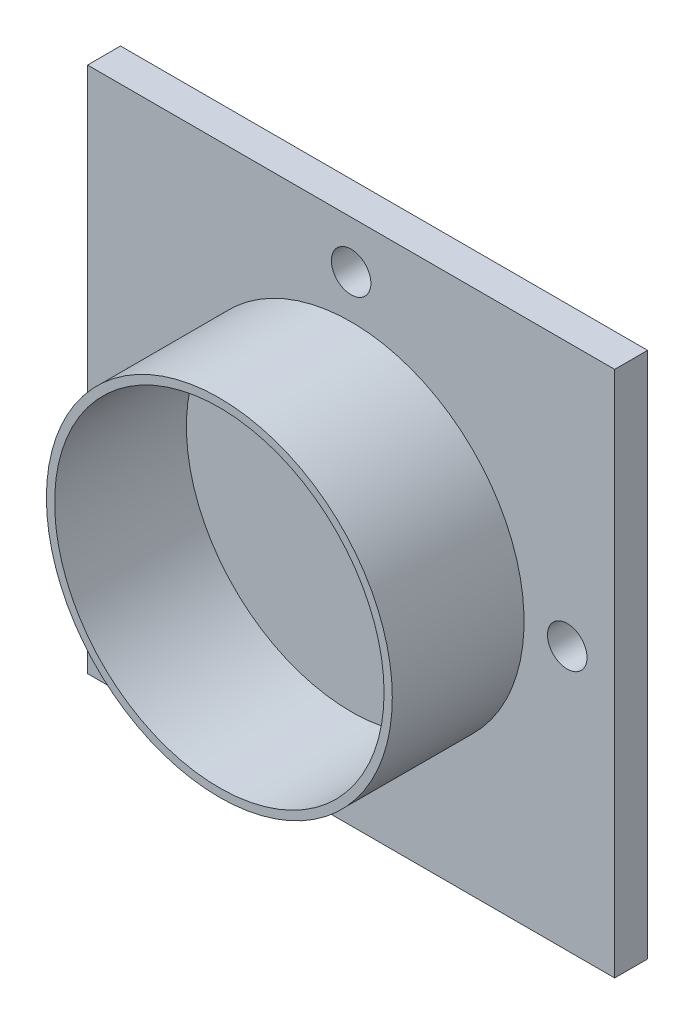
ISO-10303-21;
HEADER;
FILE_DESCRIPTION(('STEP AP214'),'2;1');
FILE_NAME('part.step','',(''),(''),'','','');
FILE_SCHEMA(('AUTOMOTIVE_DESIGN { 1 0 10303 214 1 1 1 1 }'));
ENDSEC;
DATA;
#1=APPLICATION_CONTEXT('core data for automotive mechanical design processes');
#2=APPLICATION_PROTOCOL_DEFINITION('international standard','automotive_design',2000,#1);
#3=PRODUCT_CONTEXT('',#1,'mechanical');
#4=PRODUCT('Part','Part','',(#3));
#5=PRODUCT_RELATED_PRODUCT_CATEGORY('part','',(#4));
#6=PRODUCT_DEFINITION_FORMATION('','',#4);
#7=PRODUCT_DEFINITION_CONTEXT('part definition',#1,'design');
#8=PRODUCT_DEFINITION('design','',#6,#7);
#9=PRODUCT_DEFINITION_SHAPE('','',#8);
#10=(LENGTH_UNIT() NAMED_UNIT(*) SI_UNIT(.MILLI.,.METRE.));
#11=(NAMED_UNIT(*) PLANE_ANGLE_UNIT() SI_UNIT($,.RADIAN.));
#12=(NAMED_UNIT(*) SI_UNIT($,.STERADIAN.) SOLID_ANGLE_UNIT());
#13=UNCERTAINTY_MEASURE_WITH_UNIT(LENGTH_MEASURE(1.E-05),#10,'distance_accuracy_value','');
#14=(GEOMETRIC_REPRESENTATION_CONTEXT(3) GLOBAL_UNCERTAINTY_ASSIGNED_CONTEXT((#13)) GLOBAL_UNIT_ASSIGNED_CONTEXT((#10,
#11,#12)) REPRESENTATION_CONTEXT('',''));
#15=CARTESIAN_POINT('',(0.,0.,0.));
#16=DIRECTION('',(0.,0.,1.));
#17=DIRECTION('',(1.,0.,0.));
#18=AXIS2_PLACEMENT_3D('',#15,#16,#17);
#19=CARTESIAN_POINT('',(-39.9047680999544,-160.,20.));
#20=DIRECTION('',(1.,0.,0.));
#21=DIRECTION('',(0.,0.,-1.));
#22=AXIS2_PLACEMENT_3D('',#19,#20,#21);
#23=PLANE('',#22);
#24=DIRECTION('',(0.,-1.,0.));
#25=VECTOR('',#24,1.);
#26=CARTESIAN_POINT('',(-39.9047680999544,-160.,0.));
#27=LINE('',#26,#25);
#28=CARTESIAN_POINT('',(-39.9047680999544,160.,0.));
#29=VERTEX_POINT('',#28);
#30=CARTESIAN_POINT('',(-39.9047680999544,-160.,0.));
#31=VERTEX_POINT('',#30);
#32=EDGE_CURVE('E107',#29,#31,#27,.T.);
#33=ORIENTED_EDGE('',*,*,#32,.T.);
#34=DIRECTION('',(0.,0.,-1.));
#35=VECTOR('',#34,1.);
#36=CARTESIAN_POINT('',(-39.9047680999544,-160.,20.));
#37=LINE('',#36,#35);
#38=CARTESIAN_POINT('',(-39.9047680999544,-160.,20.));
#39=VERTEX_POINT('',#38);
#40=EDGE_CURVE('E49',#39,#31,#37,.T.);
#41=ORIENTED_EDGE('',*,*,#40,.F.);
#42=DIRECTION('',(0.,-1.,0.));
#43=VECTOR('',#42,1.);
#44=CARTESIAN_POINT('',(-39.9047680999544,-160.,20.));
#45=LINE('',#44,#43);
#46=CARTESIAN_POINT('',(-39.9047680999544,160.,20.));
#47=VERTEX_POINT('',#46);
#48=EDGE_CURVE('E93',#47,#39,#45,.T.);
#49=ORIENTED_EDGE('',*,*,#48,.F.);
#50=DIRECTION('',(0.,0.,-1.));
#51=VECTOR('',#50,1.);
#52=CARTESIAN_POINT('',(-39.9047680999544,160.,20.));
#53=LINE('',#52,#51);
#54=EDGE_CURVE('E103',#47,#29,#53,.T.);
#55=ORIENTED_EDGE('',*,*,#54,.T.);
#56=EDGE_LOOP('',(#33,#41,#49,#55));
#57=FACE_BOUND('',#56,.T.);
#58=ADVANCED_FACE('F41',(#57),#23,.F.);
#59=CARTESIAN_POINT('',(-39.9047680999544,-160.,20.));
#60=DIRECTION('',(0.,1.,0.));
#61=DIRECTION('',(-1.,0.,0.));
#62=AXIS2_PLACEMENT_3D('',#59,#60,#61);
#63=PLANE('',#62);
#64=DIRECTION('',(1.,0.,0.));
#65=VECTOR('',#64,1.);
#66=CARTESIAN_POINT('',(-39.9047680999544,-160.,0.));
#67=LINE('',#66,#65);
#68=CARTESIAN_POINT('',(280.095231900046,-160.,0.));
#69=VERTEX_POINT('',#68);
#70=EDGE_CURVE('E98',#31,#69,#67,.T.);
#71=ORIENTED_EDGE('',*,*,#70,.T.);
#72=DIRECTION('',(0.,0.,-1.));
#73=VECTOR('',#72,1.);
#74=CARTESIAN_POINT('',(280.095231900046,-160.,20.));
#75=LINE('',#74,#73);
#76=CARTESIAN_POINT('',(280.095231900046,-160.,20.));
#77=VERTEX_POINT('',#76);
#78=EDGE_CURVE('E96',#77,#69,#75,.T.);
#79=ORIENTED_EDGE('',*,*,#78,.F.);
#80=DIRECTION('',(1.,0.,0.));
#81=VECTOR('',#80,1.);
#82=CARTESIAN_POINT('',(-39.9047680999544,-160.,20.));
#83=LINE('',#82,#81);
#84=EDGE_CURVE('E88',#39,#77,#83,.T.);
#85=ORIENTED_EDGE('',*,*,#84,.F.);
#86=ORIENTED_EDGE('',*,*,#40,.T.);
#87=EDGE_LOOP('',(#71,#79,#85,#86));
#88=FACE_BOUND('',#87,.T.);
#89=ADVANCED_FACE('F97',(#88),#63,.F.);
#90=CARTESIAN_POINT('',(280.095231900046,-160.,20.));
#91=DIRECTION('',(-1.,0.,0.));
#92=DIRECTION('',(0.,0.,1.));
#93=AXIS2_PLACEMENT_3D('',#90,#91,#92);
#94=PLANE('',#93);
#95=DIRECTION('',(0.,1.,0.));
#96=VECTOR('',#95,1.);
#97=CARTESIAN_POINT('',(280.095231900046,-160.,0.));
#98=LINE('',#97,#96);
#99=CARTESIAN_POINT('',(280.095231900046,160.,0.));
#100=VERTEX_POINT('',#99);
#101=EDGE_CURVE('E74',#69,#100,#98,.T.);
#102=ORIENTED_EDGE('',*,*,#101,.T.);
#103=DIRECTION('',(0.,0.,-1.));
#104=VECTOR('',#103,1.);
#105=CARTESIAN_POINT('',(280.095231900046,160.,20.));
#106=LINE('',#105,#104);
#107=CARTESIAN_POINT('',(280.095231900046,160.,20.));
#108=VERTEX_POINT('',#107);
#109=EDGE_CURVE('E99',#108,#100,#106,.T.);
#110=ORIENTED_EDGE('',*,*,#109,.F.);
#111=DIRECTION('',(0.,1.,0.));
#112=VECTOR('',#111,1.);
#113=CARTESIAN_POINT('',(280.095231900046,-160.,20.));
#114=LINE('',#113,#112);
#115=EDGE_CURVE('E91',#77,#108,#114,.T.);
#116=ORIENTED_EDGE('',*,*,#115,.F.);
#117=ORIENTED_EDGE('',*,*,#78,.T.);
#118=EDGE_LOOP('',(#102,#110,#116,#117));
#119=FACE_BOUND('',#118,.T.);
#120=ADVANCED_FACE('F101',(#119),#94,.F.);
#121=CARTESIAN_POINT('',(-39.9047680999544,160.,20.));
#122=DIRECTION('',(0.,-1.,0.));
#123=DIRECTION('',(1.,0.,0.));
#124=AXIS2_PLACEMENT_3D('',#121,#122,#123);
#125=PLANE('',#124);
#126=DIRECTION('',(-1.,0.,0.));
#127=VECTOR('',#126,1.);
#128=CARTESIAN_POINT('',(-39.9047680999544,160.,0.));
#129=LINE('',#128,#127);
#130=EDGE_CURVE('E80',#100,#29,#129,.T.);
#131=ORIENTED_EDGE('',*,*,#130,.T.);
#132=ORIENTED_EDGE('',*,*,#54,.F.);
#133=DIRECTION('',(-1.,0.,0.));
#134=VECTOR('',#133,1.);
#135=CARTESIAN_POINT('',(-39.9047680999544,160.,20.));
#136=LINE('',#135,#134);
#137=EDGE_CURVE('E57',#108,#47,#136,.T.);
#138=ORIENTED_EDGE('',*,*,#137,.F.);
#139=ORIENTED_EDGE('',*,*,#109,.T.);
#140=EDGE_LOOP('',(#131,#132,#138,#139));
#141=FACE_BOUND('',#140,.T.);
#142=ADVANCED_FACE('F131',(#141),#125,.F.);
#143=CARTESIAN_POINT('',(0.,0.,20.));
#144=DIRECTION('',(0.,0.,-1.));
#145=DIRECTION('',(-1.,0.,0.));
#146=AXIS2_PLACEMENT_3D('',#143,#144,#145);
#147=PLANE('',#146);
#148=CARTESIAN_POINT('',(120.095231900046,131.208738881373,20.));
#149=DIRECTION('',(0.,0.,1.));
#150=DIRECTION('',(1.,0.,0.));
#151=AXIS2_PLACEMENT_3D('',#148,#149,#150);
#152=CIRCLE('',#151,12.);
#153=CARTESIAN_POINT('',(132.095231900046,131.208738881373,20.));
#154=VERTEX_POINT('',#153);
#155=EDGE_CURVE('E254',#154,#154,#152,.T.);
#156=ORIENTED_EDGE('',*,*,#155,.F.);
#157=EDGE_LOOP('',(#156));
#158=FACE_BOUND('',#157,.T.);
#159=CARTESIAN_POINT('',(251.303970781419,-4.30211422042248E-13,20.));
#160=DIRECTION('',(0.,0.,1.));
#161=DIRECTION('',(1.,0.,0.));
#162=AXIS2_PLACEMENT_3D('',#159,#160,#161);
#163=CIRCLE('',#162,12.);
#164=CARTESIAN_POINT('',(263.303970781419,-4.30211422042248E-13,20.));
#165=VERTEX_POINT('',#164);
#166=EDGE_CURVE('E255',#165,#165,#163,.T.);
#167=ORIENTED_EDGE('',*,*,#166,.F.);
#168=EDGE_LOOP('',(#167));
#169=FACE_BOUND('',#168,.T.);
#170=CARTESIAN_POINT('',(120.095231900045,-131.208738881373,20.));
#171=DIRECTION('',(0.,0.,1.));
#172=DIRECTION('',(1.,0.,0.));
#173=AXIS2_PLACEMENT_3D('',#170,#171,#172);
#174=CIRCLE('',#173,12.);
#175=CARTESIAN_POINT('',(132.095231900045,-131.208738881373,20.));
#176=VERTEX_POINT('',#175);
#177=EDGE_CURVE('E265',#176,#176,#174,.T.);
#178=ORIENTED_EDGE('',*,*,#177,.F.);
#179=EDGE_LOOP('',(#178));
#180=FACE_BOUND('',#179,.T.);
#181=CARTESIAN_POINT('',(-11.1135069813274,1.37390099297363E-12,20.));
#182=DIRECTION('',(0.,0.,1.));
#183=DIRECTION('',(1.,0.,0.));
#184=AXIS2_PLACEMENT_3D('',#181,#182,#183);
#185=CIRCLE('',#184,12.);
#186=CARTESIAN_POINT('',(0.886493018672574,1.37390099297363E-12,20.));
#187=VERTEX_POINT('',#186);
#188=EDGE_CURVE('E271',#187,#187,#185,.T.);
#189=ORIENTED_EDGE('',*,*,#188,.F.);
#190=EDGE_LOOP('',(#189));
#191=FACE_BOUND('',#190,.T.);
#192=CARTESIAN_POINT('',(120.095231900046,0.,20.));
#193=DIRECTION('',(0.,0.,-1.));
#194=DIRECTION('',(-1.,0.,0.));
#195=AXIS2_PLACEMENT_3D('',#192,#193,#194);
#196=CIRCLE('',#195,105.);
#197=CARTESIAN_POINT('',(15.0952319000456,0.,20.));
#198=VERTEX_POINT('',#197);
#199=EDGE_CURVE('E11',#198,#198,#196,.F.);
#200=ORIENTED_EDGE('',*,*,#199,.F.);
#201=EDGE_LOOP('',(#200));
#202=FACE_BOUND('',#201,.T.);
#203=ORIENTED_EDGE('',*,*,#48,.T.);
#204=ORIENTED_EDGE('',*,*,#84,.T.);
#205=ORIENTED_EDGE('',*,*,#115,.T.);
#206=ORIENTED_EDGE('',*,*,#137,.T.);
#207=EDGE_LOOP('',(#203,#204,#205,#206));
#208=FACE_BOUND('',#207,.T.);
#209=ADVANCED_FACE('F89',(#158,#169,#180,#191,#202,#208),#147,.F.);
#210=CARTESIAN_POINT('',(0.,0.,0.));
#211=DIRECTION('',(0.,0.,-1.));
#212=DIRECTION('',(-1.,0.,0.));
#213=AXIS2_PLACEMENT_3D('',#210,#211,#212);
#214=PLANE('',#213);
#215=CARTESIAN_POINT('',(120.095231900046,131.208738881373,0.));
#216=DIRECTION('',(0.,0.,1.));
#217=DIRECTION('',(1.,0.,0.));
#218=AXIS2_PLACEMENT_3D('',#215,#216,#217);
#219=CIRCLE('',#218,12.);
#220=CARTESIAN_POINT('',(132.095231900046,131.208738881373,0.));
#221=VERTEX_POINT('',#220);
#222=EDGE_CURVE('E251',#221,#221,#219,.T.);
#223=ORIENTED_EDGE('',*,*,#222,.T.);
#224=EDGE_LOOP('',(#223));
#225=FACE_BOUND('',#224,.T.);
#226=CARTESIAN_POINT('',(251.303970781419,-4.30211422042248E-13,0.));
#227=DIRECTION('',(0.,0.,1.));
#228=DIRECTION('',(1.,0.,0.));
#229=AXIS2_PLACEMENT_3D('',#226,#227,#228);
#230=CIRCLE('',#229,12.);
#231=CARTESIAN_POINT('',(263.303970781419,-4.30211422042248E-13,0.));
#232=VERTEX_POINT('',#231);
#233=EDGE_CURVE('E260',#232,#232,#230,.T.);
#234=ORIENTED_EDGE('',*,*,#233,.T.);
#235=EDGE_LOOP('',(#234));
#236=FACE_BOUND('',#235,.T.);
#237=CARTESIAN_POINT('',(120.095231900045,-131.208738881373,0.));
#238=DIRECTION('',(0.,0.,1.));
#239=DIRECTION('',(1.,0.,0.));
#240=AXIS2_PLACEMENT_3D('',#237,#238,#239);
#241=CIRCLE('',#240,12.);
#242=CARTESIAN_POINT('',(132.095231900045,-131.208738881373,0.));
#243=VERTEX_POINT('',#242);
#244=EDGE_CURVE('E268',#243,#243,#241,.T.);
#245=ORIENTED_EDGE('',*,*,#244,.T.);
#246=EDGE_LOOP('',(#245));
#247=FACE_BOUND('',#246,.T.);
#248=CARTESIAN_POINT('',(-11.1135069813274,1.37390099297363E-12,0.));
#249=DIRECTION('',(0.,0.,1.));
#250=DIRECTION('',(1.,0.,0.));
#251=AXIS2_PLACEMENT_3D('',#248,#249,#250);
#252=CIRCLE('',#251,12.);
#253=CARTESIAN_POINT('',(0.886493018672574,1.37390099297363E-12,0.));
#254=VERTEX_POINT('',#253);
#255=EDGE_CURVE('E274',#254,#254,#252,.T.);
#256=ORIENTED_EDGE('',*,*,#255,.T.);
#257=EDGE_LOOP('',(#256));
#258=FACE_BOUND('',#257,.T.);
#259=ORIENTED_EDGE('',*,*,#32,.F.);
#260=ORIENTED_EDGE('',*,*,#130,.F.);
#261=ORIENTED_EDGE('',*,*,#101,.F.);
#262=ORIENTED_EDGE('',*,*,#70,.F.);
#263=EDGE_LOOP('',(#259,#260,#261,#262));
#264=FACE_BOUND('',#263,.T.);
#265=ADVANCED_FACE('F118',(#225,#236,#247,#258,#264),#214,.T.);
#266=CARTESIAN_POINT('',(120.095231900046,0.,100.));
#267=DIRECTION('',(0.,0.,1.));
#268=DIRECTION('',(1.,0.,0.));
#269=AXIS2_PLACEMENT_3D('',#266,#267,#268);
#270=PLANE('',#269);
#271=CARTESIAN_POINT('',(120.095231900046,0.,100.));
#272=DIRECTION('',(0.,0.,1.));
#273=DIRECTION('',(1.,0.,0.));
#274=AXIS2_PLACEMENT_3D('',#271,#272,#273);
#275=CIRCLE('',#274,105.);
#276=CARTESIAN_POINT('',(225.095231900046,0.,100.));
#277=VERTEX_POINT('',#276);
#278=EDGE_CURVE('E110',#277,#277,#275,.T.);
#279=ORIENTED_EDGE('',*,*,#278,.T.);
#280=EDGE_LOOP('',(#279));
#281=FACE_BOUND('',#280,.T.);
#282=CARTESIAN_POINT('',(120.095231900046,0.,100.));
#283=DIRECTION('',(0.,0.,1.));
#284=DIRECTION('',(1.,0.,0.));
#285=AXIS2_PLACEMENT_3D('',#282,#283,#284);
#286=CIRCLE('',#285,100.);
#287=CARTESIAN_POINT('',(220.095231900046,0.,100.));
#288=VERTEX_POINT('',#287);
#289=EDGE_CURVE('E277',#288,#288,#286,.T.);
#290=ORIENTED_EDGE('',*,*,#289,.F.);
#291=EDGE_LOOP('',(#290));
#292=FACE_BOUND('',#291,.T.);
#293=ADVANCED_FACE('F120',(#281,#292),#270,.T.);
#294=CARTESIAN_POINT('',(120.095231900046,0.,100.));
#295=DIRECTION('',(0.,0.,-1.));
#296=DIRECTION('',(-1.,0.,0.));
#297=AXIS2_PLACEMENT_3D('',#294,#295,#296);
#298=CYLINDRICAL_SURFACE('',#297,105.);
#299=ORIENTED_EDGE('',*,*,#278,.F.);
#300=EDGE_LOOP('',(#299));
#301=FACE_BOUND('',#300,.T.);
#302=ORIENTED_EDGE('',*,*,#199,.T.);
#303=EDGE_LOOP('',(#302));
#304=FACE_BOUND('',#303,.T.);
#305=ADVANCED_FACE('F128',(#301,#304),#298,.T.);
#306=CARTESIAN_POINT('',(120.095231900046,0.,100.));
#307=DIRECTION('',(0.,0.,-1.));
#308=DIRECTION('',(-1.,0.,0.));
#309=AXIS2_PLACEMENT_3D('',#306,#307,#308);
#310=CYLINDRICAL_SURFACE('',#309,100.);
#311=ORIENTED_EDGE('',*,*,#289,.T.);
#312=EDGE_LOOP('',(#311));
#313=FACE_BOUND('',#312,.T.);
#314=CARTESIAN_POINT('',(120.095231900046,0.,20.));
#315=DIRECTION('',(0.,0.,1.));
#316=DIRECTION('',(1.,0.,0.));
#317=AXIS2_PLACEMENT_3D('',#314,#315,#316);
#318=CIRCLE('',#317,100.);
#319=CARTESIAN_POINT('',(220.095231900046,0.,20.));
#320=VERTEX_POINT('',#319);
#321=EDGE_CURVE('E257',#320,#320,#318,.T.);
#322=ORIENTED_EDGE('',*,*,#321,.F.);
#323=EDGE_LOOP('',(#322));
#324=FACE_BOUND('',#323,.T.);
#325=ADVANCED_FACE('F165',(#313,#324),#310,.F.);
#326=ORIENTED_EDGE('',*,*,#321,.T.);
#327=EDGE_LOOP('',(#326));
#328=FACE_BOUND('',#327,.T.);
#329=ADVANCED_FACE('F134',(#328),#147,.F.);
#330=CARTESIAN_POINT('',(-11.1135069813274,1.37390099297363E-12,0.));
#331=DIRECTION('',(0.,0.,1.));
#332=DIRECTION('',(1.,0.,0.));
#333=AXIS2_PLACEMENT_3D('',#330,#331,#332);
#334=CYLINDRICAL_SURFACE('',#333,12.);
#335=ORIENTED_EDGE('',*,*,#255,.F.);
#336=EDGE_LOOP('',(#335));
#337=FACE_BOUND('',#336,.T.);
#338=ORIENTED_EDGE('',*,*,#188,.T.);
#339=EDGE_LOOP('',(#338));
#340=FACE_BOUND('',#339,.T.);
#341=ADVANCED_FACE('F182',(#337,#340),#334,.F.);
#342=CARTESIAN_POINT('',(120.095231900045,-131.208738881373,0.));
#343=DIRECTION('',(0.,0.,1.));
#344=DIRECTION('',(1.,0.,0.));
#345=AXIS2_PLACEMENT_3D('',#342,#343,#344);
#346=CYLINDRICAL_SURFACE('',#345,12.);
#347=ORIENTED_EDGE('',*,*,#244,.F.);
#348=EDGE_LOOP('',(#347));
#349=FACE_BOUND('',#348,.T.);
#350=ORIENTED_EDGE('',*,*,#177,.T.);
#351=EDGE_LOOP('',(#350));
#352=FACE_BOUND('',#351,.T.);
#353=ADVANCED_FACE('F215',(#349,#352),#346,.F.);
#354=CARTESIAN_POINT('',(251.303970781419,-4.30211422042248E-13,0.));
#355=DIRECTION('',(0.,0.,1.));
#356=DIRECTION('',(1.,0.,0.));
#357=AXIS2_PLACEMENT_3D('',#354,#355,#356);
#358=CYLINDRICAL_SURFACE('',#357,12.);
#359=ORIENTED_EDGE('',*,*,#233,.F.);
#360=EDGE_LOOP('',(#359));
#361=FACE_BOUND('',#360,.T.);
#362=ORIENTED_EDGE('',*,*,#166,.T.);
#363=EDGE_LOOP('',(#362));
#364=FACE_BOUND('',#363,.T.);
#365=ADVANCED_FACE('F224',(#361,#364),#358,.F.);
#366=CARTESIAN_POINT('',(120.095231900046,131.208738881373,0.));
#367=DIRECTION('',(0.,0.,1.));
#368=DIRECTION('',(1.,0.,0.));
#369=AXIS2_PLACEMENT_3D('',#366,#367,#368);
#370=CYLINDRICAL_SURFACE('',#369,12.);
#371=ORIENTED_EDGE('',*,*,#222,.F.);
#372=EDGE_LOOP('',(#371));
#373=FACE_BOUND('',#372,.T.);
#374=ORIENTED_EDGE('',*,*,#155,.T.);
#375=EDGE_LOOP('',(#374));
#376=FACE_BOUND('',#375,.T.);
#377=ADVANCED_FACE('F233',(#373,#376),#370,.F.);
#378=CLOSED_SHELL('',(#58,#89,#120,#142,#209,#265,#293,#305,#325,#329,#341,#353,#365,#377));
#379=MANIFOLD_SOLID_BREP('B2',#378);
#380=ADVANCED_BREP_SHAPE_REPRESENTATION('',(#18,#379),#14);
#381=SHAPE_DEFINITION_REPRESENTATION(#9,#380);
ENDSEC;
END-ISO-10303-21;
